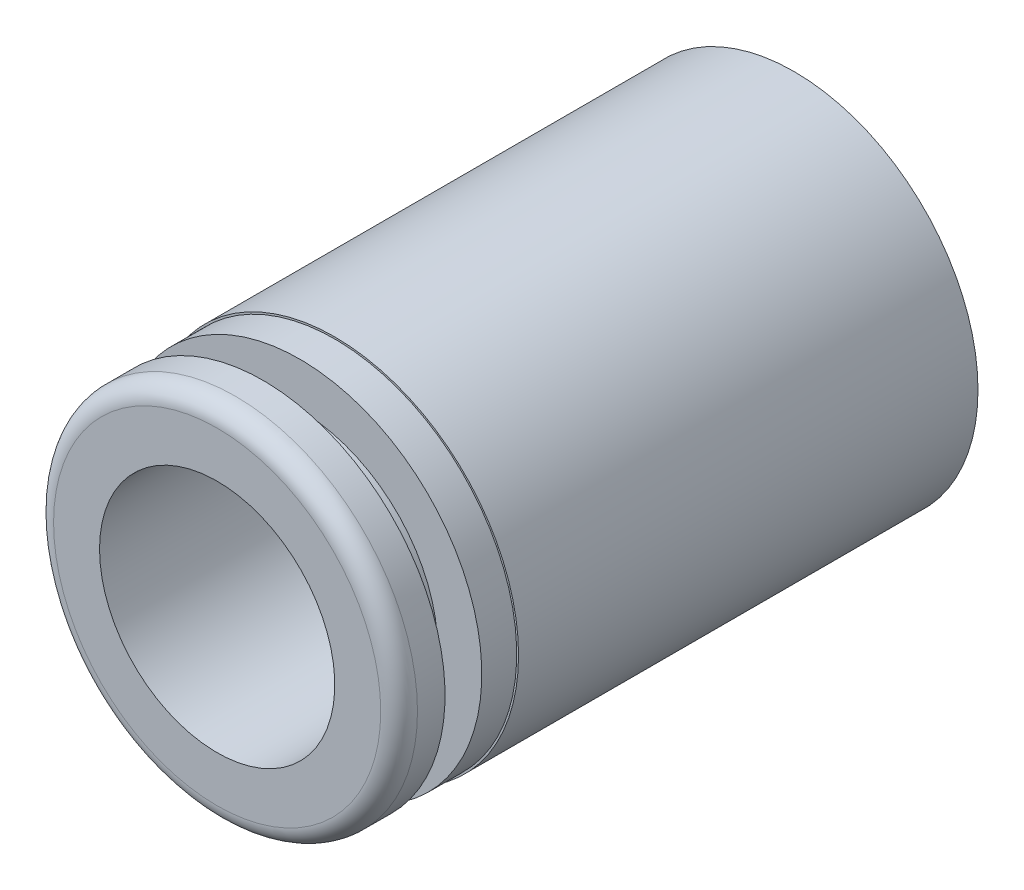
ISO-10303-21;
HEADER;
FILE_DESCRIPTION(('STEP AP214'),'2;1');
FILE_NAME('part.step','',(''),(''),'','','');
FILE_SCHEMA(('AUTOMOTIVE_DESIGN { 1 0 10303 214 1 1 1 1 }'));
ENDSEC;
DATA;
#1=APPLICATION_CONTEXT('core data for automotive mechanical design processes');
#2=APPLICATION_PROTOCOL_DEFINITION('international standard','automotive_design',2000,#1);
#3=PRODUCT_CONTEXT('',#1,'mechanical');
#4=PRODUCT('Part','Part','',(#3));
#5=PRODUCT_RELATED_PRODUCT_CATEGORY('part','',(#4));
#6=PRODUCT_DEFINITION_FORMATION('','',#4);
#7=PRODUCT_DEFINITION_CONTEXT('part definition',#1,'design');
#8=PRODUCT_DEFINITION('design','',#6,#7);
#9=PRODUCT_DEFINITION_SHAPE('','',#8);
#10=(LENGTH_UNIT() NAMED_UNIT(*) SI_UNIT(.MILLI.,.METRE.));
#11=(NAMED_UNIT(*) PLANE_ANGLE_UNIT() SI_UNIT($,.RADIAN.));
#12=(NAMED_UNIT(*) SI_UNIT($,.STERADIAN.) SOLID_ANGLE_UNIT());
#13=UNCERTAINTY_MEASURE_WITH_UNIT(LENGTH_MEASURE(1.E-05),#10,'distance_accuracy_value','');
#14=(GEOMETRIC_REPRESENTATION_CONTEXT(3) GLOBAL_UNCERTAINTY_ASSIGNED_CONTEXT((#13)) GLOBAL_UNIT_ASSIGNED_CONTEXT((#10,
#11,#12)) REPRESENTATION_CONTEXT('',''));
#15=CARTESIAN_POINT('',(0.,0.,0.));
#16=DIRECTION('',(0.,0.,1.));
#17=DIRECTION('',(1.,0.,0.));
#18=AXIS2_PLACEMENT_3D('',#15,#16,#17);
#19=CARTESIAN_POINT('',(0.,0.,14.45));
#20=DIRECTION('',(0.,0.,1.));
#21=DIRECTION('',(1.,0.,0.));
#22=AXIS2_PLACEMENT_3D('',#19,#20,#21);
#23=PLANE('',#22);
#24=CARTESIAN_POINT('',(0.,0.,14.45));
#25=DIRECTION('',(0.,0.,-1.));
#26=DIRECTION('',(-1.,0.,0.));
#27=AXIS2_PLACEMENT_3D('',#24,#25,#26);
#28=CIRCLE('',#27,3.75);
#29=CARTESIAN_POINT('',(-3.75,0.,14.45));
#30=VERTEX_POINT('',#29);
#31=EDGE_CURVE('E88',#30,#30,#28,.T.);
#32=ORIENTED_EDGE('',*,*,#31,.F.);
#33=EDGE_LOOP('',(#32));
#34=FACE_BOUND('',#33,.T.);
#35=CARTESIAN_POINT('',(0.,0.,14.45));
#36=DIRECTION('',(0.,0.,-1.));
#37=DIRECTION('',(-1.,0.,0.));
#38=AXIS2_PLACEMENT_3D('',#35,#36,#37);
#39=CIRCLE('',#38,4.95);
#40=CARTESIAN_POINT('',(-4.95,0.,14.45));
#41=VERTEX_POINT('',#40);
#42=EDGE_CURVE('E106',#41,#41,#39,.F.);
#43=ORIENTED_EDGE('',*,*,#42,.F.);
#44=EDGE_LOOP('',(#43));
#45=FACE_BOUND('',#44,.T.);
#46=ADVANCED_FACE('F17',(#34,#45),#23,.F.);
#47=CARTESIAN_POINT('',(0.,0.,15.7));
#48=DIRECTION('',(0.,0.,-1.));
#49=DIRECTION('',(-1.,0.,0.));
#50=AXIS2_PLACEMENT_3D('',#47,#48,#49);
#51=CYLINDRICAL_SURFACE('',#50,4.95);
#52=CARTESIAN_POINT('',(0.,0.,15.2));
#53=DIRECTION('',(0.,0.,1.));
#54=DIRECTION('',(1.,0.,0.));
#55=AXIS2_PLACEMENT_3D('',#52,#53,#54);
#56=CIRCLE('',#55,4.95);
#57=CARTESIAN_POINT('',(4.95,0.,15.2));
#58=VERTEX_POINT('',#57);
#59=EDGE_CURVE('E81',#58,#58,#56,.T.);
#60=ORIENTED_EDGE('',*,*,#59,.F.);
#61=EDGE_LOOP('',(#60));
#62=FACE_BOUND('',#61,.T.);
#63=ORIENTED_EDGE('',*,*,#42,.T.);
#64=EDGE_LOOP('',(#63));
#65=FACE_BOUND('',#64,.T.);
#66=ADVANCED_FACE('F110',(#62,#65),#51,.T.);
#67=CARTESIAN_POINT('',(0.,0.,14.45));
#68=DIRECTION('',(0.,0.,-1.));
#69=DIRECTION('',(-1.,0.,0.));
#70=AXIS2_PLACEMENT_3D('',#67,#68,#69);
#71=CYLINDRICAL_SURFACE('',#70,3.75);
#72=CARTESIAN_POINT('',(0.,0.,13.45));
#73=DIRECTION('',(0.,0.,-1.));
#74=DIRECTION('',(-1.,0.,0.));
#75=AXIS2_PLACEMENT_3D('',#72,#73,#74);
#76=CIRCLE('',#75,3.75);
#77=CARTESIAN_POINT('',(-3.75,0.,13.45));
#78=VERTEX_POINT('',#77);
#79=EDGE_CURVE('E41',#78,#78,#76,.T.);
#80=ORIENTED_EDGE('',*,*,#79,.F.);
#81=EDGE_LOOP('',(#80));
#82=FACE_BOUND('',#81,.T.);
#83=ORIENTED_EDGE('',*,*,#31,.T.);
#84=EDGE_LOOP('',(#83));
#85=FACE_BOUND('',#84,.T.);
#86=ADVANCED_FACE('F74',(#82,#85),#71,.T.);
#87=CARTESIAN_POINT('',(0.,0.,15.2));
#88=DIRECTION('',(0.,0.,1.));
#89=DIRECTION('',(1.,0.,0.));
#90=AXIS2_PLACEMENT_3D('',#87,#88,#89);
#91=TOROIDAL_SURFACE('',#90,4.45,0.5);
#92=ORIENTED_EDGE('',*,*,#59,.T.);
#93=EDGE_LOOP('',(#92));
#94=FACE_BOUND('',#93,.T.);
#95=CARTESIAN_POINT('',(0.,0.,15.7));
#96=DIRECTION('',(0.,0.,-1.));
#97=DIRECTION('',(1.,0.,0.));
#98=AXIS2_PLACEMENT_3D('',#95,#96,#97);
#99=CIRCLE('',#98,4.45);
#100=CARTESIAN_POINT('',(-4.45,0.,15.7));
#101=VERTEX_POINT('',#100);
#102=CARTESIAN_POINT('',(4.45,0.,15.7));
#103=VERTEX_POINT('',#102);
#104=EDGE_CURVE('E34',#101,#103,#99,.F.);
#105=ORIENTED_EDGE('',*,*,#104,.F.);
#106=CARTESIAN_POINT('',(0.,0.,15.7));
#107=DIRECTION('',(0.,0.,-1.));
#108=DIRECTION('',(-1.,0.,0.));
#109=AXIS2_PLACEMENT_3D('',#106,#107,#108);
#110=CIRCLE('',#109,4.45);
#111=EDGE_CURVE('E37',#103,#101,#110,.F.);
#112=ORIENTED_EDGE('',*,*,#111,.F.);
#113=EDGE_LOOP('',(#105,#112));
#114=FACE_BOUND('',#113,.T.);
#115=ADVANCED_FACE('F38',(#94,#114),#91,.T.);
#116=CARTESIAN_POINT('',(0.,0.,13.45));
#117=DIRECTION('',(0.,0.,1.));
#118=DIRECTION('',(1.,0.,0.));
#119=AXIS2_PLACEMENT_3D('',#116,#117,#118);
#120=PLANE('',#119);
#121=ORIENTED_EDGE('',*,*,#79,.T.);
#122=EDGE_LOOP('',(#121));
#123=FACE_BOUND('',#122,.T.);
#124=CARTESIAN_POINT('',(0.,0.,13.45));
#125=DIRECTION('',(0.,0.,-1.));
#126=DIRECTION('',(-1.,0.,0.));
#127=AXIS2_PLACEMENT_3D('',#124,#125,#126);
#128=CIRCLE('',#127,4.95);
#129=CARTESIAN_POINT('',(-4.95,0.,13.45));
#130=VERTEX_POINT('',#129);
#131=EDGE_CURVE('E45',#130,#130,#128,.T.);
#132=ORIENTED_EDGE('',*,*,#131,.F.);
#133=EDGE_LOOP('',(#132));
#134=FACE_BOUND('',#133,.T.);
#135=ADVANCED_FACE('F65',(#123,#134),#120,.T.);
#136=CARTESIAN_POINT('',(0.,0.,15.7));
#137=DIRECTION('',(0.,0.,1.));
#138=DIRECTION('',(1.,0.,0.));
#139=AXIS2_PLACEMENT_3D('',#136,#137,#138);
#140=PLANE('',#139);
#141=CARTESIAN_POINT('',(0.,0.,15.7));
#142=DIRECTION('',(0.,0.,-1.));
#143=DIRECTION('',(-1.,0.,0.));
#144=AXIS2_PLACEMENT_3D('',#141,#142,#143);
#145=CIRCLE('',#144,3.2);
#146=CARTESIAN_POINT('',(-3.2,0.,15.7));
#147=VERTEX_POINT('',#146);
#148=EDGE_CURVE('E98',#147,#147,#145,.T.);
#149=ORIENTED_EDGE('',*,*,#148,.T.);
#150=EDGE_LOOP('',(#149));
#151=FACE_BOUND('',#150,.T.);
#152=ORIENTED_EDGE('',*,*,#111,.T.);
#153=ORIENTED_EDGE('',*,*,#104,.T.);
#154=EDGE_LOOP('',(#152,#153));
#155=FACE_BOUND('',#154,.T.);
#156=ADVANCED_FACE('F44',(#151,#155),#140,.T.);
#157=CARTESIAN_POINT('',(0.,0.,13.45));
#158=DIRECTION('',(0.,0.,-1.));
#159=DIRECTION('',(-1.,0.,0.));
#160=AXIS2_PLACEMENT_3D('',#157,#158,#159);
#161=CYLINDRICAL_SURFACE('',#160,4.95);
#162=CARTESIAN_POINT('',(0.,0.,12.5));
#163=DIRECTION('',(0.,0.,-1.));
#164=DIRECTION('',(-1.,0.,0.));
#165=AXIS2_PLACEMENT_3D('',#162,#163,#164);
#166=CIRCLE('',#165,4.95);
#167=CARTESIAN_POINT('',(-4.95,0.,12.5));
#168=VERTEX_POINT('',#167);
#169=EDGE_CURVE('E95',#168,#168,#166,.T.);
#170=ORIENTED_EDGE('',*,*,#169,.F.);
#171=EDGE_LOOP('',(#170));
#172=FACE_BOUND('',#171,.T.);
#173=ORIENTED_EDGE('',*,*,#131,.T.);
#174=EDGE_LOOP('',(#173));
#175=FACE_BOUND('',#174,.T.);
#176=ADVANCED_FACE('F64',(#172,#175),#161,.T.);
#177=CARTESIAN_POINT('',(0.,0.,12.5));
#178=DIRECTION('',(0.,0.,-1.));
#179=DIRECTION('',(-1.,0.,0.));
#180=AXIS2_PLACEMENT_3D('',#177,#178,#179);
#181=CYLINDRICAL_SURFACE('',#180,3.2);
#182=CARTESIAN_POINT('',(0.,0.,0.));
#183=DIRECTION('',(0.,0.,-1.));
#184=DIRECTION('',(-1.,0.,0.));
#185=AXIS2_PLACEMENT_3D('',#182,#183,#184);
#186=CIRCLE('',#185,3.2);
#187=CARTESIAN_POINT('',(-3.2,0.,0.));
#188=VERTEX_POINT('',#187);
#189=EDGE_CURVE('E92',#188,#188,#186,.T.);
#190=ORIENTED_EDGE('',*,*,#189,.T.);
#191=EDGE_LOOP('',(#190));
#192=FACE_BOUND('',#191,.T.);
#193=ORIENTED_EDGE('',*,*,#148,.F.);
#194=EDGE_LOOP('',(#193));
#195=FACE_BOUND('',#194,.T.);
#196=ADVANCED_FACE('F134',(#192,#195),#181,.F.);
#197=CARTESIAN_POINT('',(0.,0.,12.5));
#198=DIRECTION('',(0.,0.,1.));
#199=DIRECTION('',(1.,0.,0.));
#200=AXIS2_PLACEMENT_3D('',#197,#198,#199);
#201=PLANE('',#200);
#202=ORIENTED_EDGE('',*,*,#169,.T.);
#203=EDGE_LOOP('',(#202));
#204=FACE_BOUND('',#203,.T.);
#205=CARTESIAN_POINT('',(0.,0.,12.5));
#206=DIRECTION('',(0.,0.,-1.));
#207=DIRECTION('',(-1.,0.,0.));
#208=AXIS2_PLACEMENT_3D('',#205,#206,#207);
#209=CIRCLE('',#208,5.);
#210=CARTESIAN_POINT('',(-5.,0.,12.5));
#211=VERTEX_POINT('',#210);
#212=EDGE_CURVE('E27',#211,#211,#209,.T.);
#213=ORIENTED_EDGE('',*,*,#212,.F.);
#214=EDGE_LOOP('',(#213));
#215=FACE_BOUND('',#214,.T.);
#216=ADVANCED_FACE('F128',(#204,#215),#201,.T.);
#217=CARTESIAN_POINT('',(0.,0.,0.));
#218=DIRECTION('',(0.,0.,1.));
#219=DIRECTION('',(1.,0.,0.));
#220=AXIS2_PLACEMENT_3D('',#217,#218,#219);
#221=PLANE('',#220);
#222=ORIENTED_EDGE('',*,*,#189,.F.);
#223=EDGE_LOOP('',(#222));
#224=FACE_BOUND('',#223,.T.);
#225=CARTESIAN_POINT('',(0.,0.,0.));
#226=DIRECTION('',(0.,0.,-1.));
#227=DIRECTION('',(-1.,0.,0.));
#228=AXIS2_PLACEMENT_3D('',#225,#226,#227);
#229=CIRCLE('',#228,5.);
#230=CARTESIAN_POINT('',(-5.,0.,0.));
#231=VERTEX_POINT('',#230);
#232=EDGE_CURVE('E11',#231,#231,#229,.F.);
#233=ORIENTED_EDGE('',*,*,#232,.F.);
#234=EDGE_LOOP('',(#233));
#235=FACE_BOUND('',#234,.T.);
#236=ADVANCED_FACE('F122',(#224,#235),#221,.F.);
#237=CARTESIAN_POINT('',(0.,0.,12.5));
#238=DIRECTION('',(0.,0.,-1.));
#239=DIRECTION('',(-1.,0.,0.));
#240=AXIS2_PLACEMENT_3D('',#237,#238,#239);
#241=CYLINDRICAL_SURFACE('',#240,5.);
#242=ORIENTED_EDGE('',*,*,#232,.T.);
#243=EDGE_LOOP('',(#242));
#244=FACE_BOUND('',#243,.T.);
#245=ORIENTED_EDGE('',*,*,#212,.T.);
#246=EDGE_LOOP('',(#245));
#247=FACE_BOUND('',#246,.T.);
#248=ADVANCED_FACE('F120',(#244,#247),#241,.T.);
#249=CLOSED_SHELL('',(#46,#66,#86,#115,#135,#156,#176,#196,#216,#236,#248));
#250=MANIFOLD_SOLID_BREP('B1',#249);
#251=ADVANCED_BREP_SHAPE_REPRESENTATION('',(#18,#250),#14);
#252=SHAPE_DEFINITION_REPRESENTATION(#9,#251);
ENDSEC;
END-ISO-10303-21;
